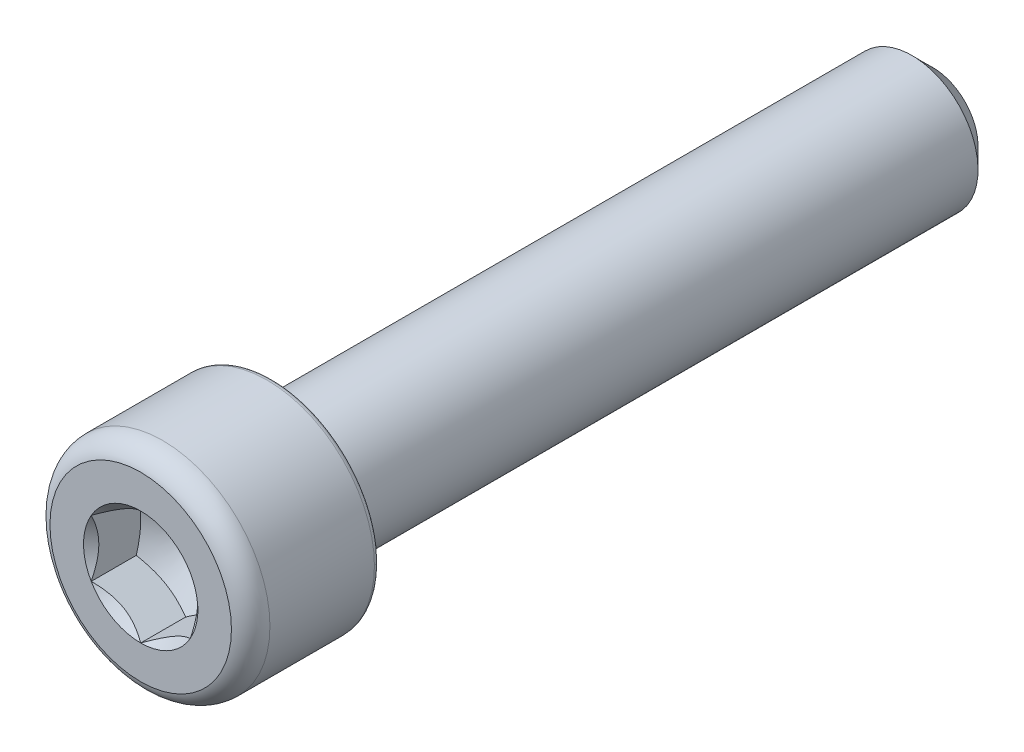
ISO-10303-21;
HEADER;
FILE_DESCRIPTION(('STEP AP214'),'2;1');
FILE_NAME('part.step','',(''),(''),'','','');
FILE_SCHEMA(('AUTOMOTIVE_DESIGN { 1 0 10303 214 1 1 1 1 }'));
ENDSEC;
DATA;
#1=APPLICATION_CONTEXT('core data for automotive mechanical design processes');
#2=APPLICATION_PROTOCOL_DEFINITION('international standard','automotive_design',2000,#1);
#3=PRODUCT_CONTEXT('',#1,'mechanical');
#4=PRODUCT('Part','Part','',(#3));
#5=PRODUCT_RELATED_PRODUCT_CATEGORY('part','',(#4));
#6=PRODUCT_DEFINITION_FORMATION('','',#4);
#7=PRODUCT_DEFINITION_CONTEXT('part definition',#1,'design');
#8=PRODUCT_DEFINITION('design','',#6,#7);
#9=PRODUCT_DEFINITION_SHAPE('','',#8);
#10=(LENGTH_UNIT() NAMED_UNIT(*) SI_UNIT(.MILLI.,.METRE.));
#11=(NAMED_UNIT(*) PLANE_ANGLE_UNIT() SI_UNIT($,.RADIAN.));
#12=(NAMED_UNIT(*) SI_UNIT($,.STERADIAN.) SOLID_ANGLE_UNIT());
#13=UNCERTAINTY_MEASURE_WITH_UNIT(LENGTH_MEASURE(1.E-05),#10,'distance_accuracy_value','');
#14=(GEOMETRIC_REPRESENTATION_CONTEXT(3) GLOBAL_UNCERTAINTY_ASSIGNED_CONTEXT((#13)) GLOBAL_UNIT_ASSIGNED_CONTEXT((#10,
#11,#12)) REPRESENTATION_CONTEXT('',''));
#15=CARTESIAN_POINT('',(0.,0.,0.));
#16=DIRECTION('',(0.,0.,1.));
#17=DIRECTION('',(1.,0.,0.));
#18=AXIS2_PLACEMENT_3D('',#15,#16,#17);
#19=CARTESIAN_POINT('',(2.77555756156289E-13,3.46410161513801,-40.001));
#20=DIRECTION('',(-0.500000000000194,0.866025403784333,0.));
#21=DIRECTION('',(0.,0.,1.));
#22=AXIS2_PLACEMENT_3D('',#19,#20,#21);
#23=PLANE('',#22);
#24=DIRECTION('',(0.,0.,1.));
#25=VECTOR('',#24,1.);
#26=CARTESIAN_POINT('',(2.77555756156289E-13,3.46410161513801,-40.001));
#27=LINE('',#26,#25);
#28=CARTESIAN_POINT('',(3.33066907387547E-13,3.46410161513841,5.26794919243118));
#29=VERTEX_POINT('',#28);
#30=CARTESIAN_POINT('',(2.77555756156289E-13,3.46410161513817,8.00000000000023));
#31=VERTEX_POINT('',#30);
#32=EDGE_CURVE('E90',#29,#31,#27,.T.);
#33=ORIENTED_EDGE('',*,*,#32,.T.);
#34=CARTESIAN_POINT('',(2.77555756156289E-13,3.46410161513801,8.00000000000001));
#35=CARTESIAN_POINT('',(-0.103111458400397,3.40457018687381,7.94052569636649));
#36=CARTESIAN_POINT('',(-0.207946952701811,3.34404338601823,7.88454499923359));
#37=CARTESIAN_POINT('',(-0.421717283964763,3.22062302771875,7.78204673285732));
#38=CARTESIAN_POINT('',(-0.530672439387035,3.15771773940607,7.7355861749818));
#39=CARTESIAN_POINT('',(-0.75037514554537,3.0308723228638,7.65599891920528));
#40=CARTESIAN_POINT('',(-0.861066775102813,2.96696448074175,7.6226722358677));
#41=CARTESIAN_POINT('',(-1.08488631359684,2.83774220994224,7.57132616069147));
#42=CARTESIAN_POINT('',(-1.19800738988464,2.77243172609642,7.55326845522562));
#43=CARTESIAN_POINT('',(-1.39297651977399,2.65986624647108,7.53697523660008));
#44=CARTESIAN_POINT('',(-1.47457294024025,2.61275653114996,7.53456399613885));
#45=CARTESIAN_POINT('',(-1.63763295194036,2.5186137895008,7.53863151800921));
#46=CARTESIAN_POINT('',(-1.71909648659805,2.47158079583702,7.54511339636598));
#47=CARTESIAN_POINT('',(-1.88125166539161,2.37796045971001,7.56659704582311));
#48=CARTESIAN_POINT('',(-1.96194234377534,2.33137367482404,7.58160834257759));
#49=CARTESIAN_POINT('',(-2.12193782914344,2.23900023827762,7.6193315134903));
#50=CARTESIAN_POINT('',(-2.20124274192261,2.19321352553653,7.64204279707655));
#51=CARTESIAN_POINT('',(-2.34201325186341,2.1119396337282,7.6887637141652));
#52=CARTESIAN_POINT('',(-2.403790802559,2.07627234820417,7.71154386353576));
#53=CARTESIAN_POINT('',(-2.52623714694077,2.005577918314,7.76077453968896));
#54=CARTESIAN_POINT('',(-2.58690590713626,1.97055079328373,7.78722517713096));
#55=CARTESIAN_POINT('',(-2.70694350306049,1.90124705496397,7.84320408343037));
#56=CARTESIAN_POINT('',(-2.76631575256041,1.86696847073277,7.8727226728238));
#57=CARTESIAN_POINT('',(-2.88396102179764,1.79904594286974,7.93445005428535));
#58=CARTESIAN_POINT('',(-2.94223468873338,1.76540162557773,7.96665719763615));
#59=CARTESIAN_POINT('',(-2.99999999999973,1.73205080756832,7.9999999999994));
#60=B_SPLINE_CURVE_WITH_KNOTS('',3,(#34,#35,#36,#37,#38,#39,#40,#41,#42,#43,#44,#45,#46,#47,#48,
#49,#50,#51,#52,#53,#54,#55,#56,#57,#58,#59),.UNSPECIFIED.,.F.,.F.,(4,2,2,2,2,2,2,2,2,2,2,2,4),
(0.,0.399548839741992,0.801424624398686,1.19691998044408,1.59141997110831,1.87377108834585,
2.15622116275918,2.43898729915445,2.72173175291632,2.94627735489401,3.17082972803472,
3.39469398397043,3.61842195288795),.UNSPECIFIED.);
#61=CARTESIAN_POINT('',(-3.00000000000017,1.73205080756861,7.99999999999967));
#62=VERTEX_POINT('',#61);
#63=EDGE_CURVE('E101',#31,#62,#60,.T.);
#64=ORIENTED_EDGE('',*,*,#63,.T.);
#65=DIRECTION('',(0.,0.,1.));
#66=VECTOR('',#65,1.);
#67=CARTESIAN_POINT('',(-3.00000000000006,1.73205080756893,-40.001));
#68=LINE('',#67,#66);
#69=CARTESIAN_POINT('',(-3.00000000000006,1.73205080756893,5.2679491924309));
#70=VERTEX_POINT('',#69);
#71=EDGE_CURVE('E11',#70,#62,#68,.T.);
#72=ORIENTED_EDGE('',*,*,#71,.F.);
#73=CARTESIAN_POINT('',(2.77555756156289E-13,3.46410161513801,5.26794919243101));
#74=CARTESIAN_POINT('',(-0.131831831344277,3.38798847182341,5.223992510121));
#75=CARTESIAN_POINT('',(-0.264801633181531,3.31121832093855,5.18401620808137));
#76=CARTESIAN_POINT('',(-0.53304352002885,3.15634879535926,5.11423877353145));
#77=CARTESIAN_POINT('',(-0.668320369626641,3.07824666982881,5.08446232293819));
#78=CARTESIAN_POINT('',(-0.93719765063798,2.92301029925783,5.03811313085015));
#79=CARTESIAN_POINT('',(-1.07075672342428,2.84589993263187,5.02123187382635));
#80=CARTESIAN_POINT('',(-1.33850298069265,2.69131655892348,5.00108294462666));
#81=CARTESIAN_POINT('',(-1.47268919265765,2.61384411332406,4.99779858339232));
#82=CARTESIAN_POINT('',(-1.7234017345643,2.46909515976495,5.00464862766313));
#83=CARTESIAN_POINT('',(-1.83996568596538,2.40179693104556,5.01310112025526));
#84=CARTESIAN_POINT('',(-2.07233421264668,2.26763889961476,5.03988514350801));
#85=CARTESIAN_POINT('',(-2.18813798482608,2.20077956057381,5.05822581458377));
#86=CARTESIAN_POINT('',(-2.42098521258644,2.06634515094625,5.10407394243822));
#87=CARTESIAN_POINT('',(-2.53799921307495,1.9987870862652,5.13177565575813));
#88=CARTESIAN_POINT('',(-2.77028245500699,1.86467829400746,5.19464683368964));
#89=CARTESIAN_POINT('',(-2.88555466997176,1.79812584966748,5.22980153555891));
#90=CARTESIAN_POINT('',(-2.99999999999973,1.73205080756844,5.26794919243062));
#91=B_SPLINE_CURVE_WITH_KNOTS('',3,(#73,#74,#75,#76,#77,#78,#79,#80,#81,#82,#83,#84,#85,#86,#87,
#88,#89,#90),.UNSPECIFIED.,.F.,.F.,(4,2,2,2,2,2,2,2,4),(0.,0.475524017335312,0.952190725540709,
1.41706140922947,1.88136133334686,2.28556167394802,2.69013629069183,3.10368243373325,
3.51641696027272),.UNSPECIFIED.);
#92=EDGE_CURVE('E21',#29,#70,#91,.T.);
#93=ORIENTED_EDGE('',*,*,#92,.F.);
#94=EDGE_LOOP('',(#33,#64,#72,#93));
#95=FACE_BOUND('',#94,.T.);
#96=ADVANCED_FACE('F17',(#95),#23,.F.);
#97=CARTESIAN_POINT('',(-3.00000000000006,1.73205080756893,-40.001));
#98=DIRECTION('',(-1.00000000000001,0.,0.));
#99=DIRECTION('',(0.,0.,1.));
#100=AXIS2_PLACEMENT_3D('',#97,#98,#99);
#101=PLANE('',#100);
#102=ORIENTED_EDGE('',*,*,#71,.T.);
#103=CARTESIAN_POINT('',(-3.,1.73205080756907,7.99999999999984));
#104=CARTESIAN_POINT('',(-3.00000000000007,1.61298795104074,7.94052569636642));
#105=CARTESIAN_POINT('',(-3.00000000000007,1.49193434932966,7.88454499923356));
#106=CARTESIAN_POINT('',(-3.00000000000005,1.24509363273084,7.78204673285737));
#107=CARTESIAN_POINT('',(-3.00000000000003,1.11928305610555,7.73558617498188));
#108=CARTESIAN_POINT('',(-3.00000000000009,0.865592223021153,7.65599891920546));
#109=CARTESIAN_POINT('',(-3.00000000000016,0.73777653877711,7.62267223586795));
#110=CARTESIAN_POINT('',(-2.99999999999995,0.479331997178312,7.57132616069169));
#111=CARTESIAN_POINT('',(-2.99999999999967,0.348711029486792,7.55326845522573));
#112=CARTESIAN_POINT('',(-2.99999999999977,0.12358007023627,7.53697523660029));
#113=CARTESIAN_POINT('',(-2.99999999999998,0.0293606395940688,7.53456399613918));
#114=CARTESIAN_POINT('',(-3.00000000000013,-0.158924843704159,7.53863151800962));
#115=CARTESIAN_POINT('',(-3.00000000000007,-0.252990831031675,7.54511339636637));
#116=CARTESIAN_POINT('',(-3.00000000000005,-0.440231503285571,7.56659704582352));
#117=CARTESIAN_POINT('',(-3.00000000000009,-0.533405073057443,7.58160834257806));
#118=CARTESIAN_POINT('',(-3.00000000000003,-0.718151946150252,7.61933151349066));
#119=CARTESIAN_POINT('',(-2.99999999999994,-0.809725371632482,7.64204279707675));
#120=CARTESIAN_POINT('',(-2.99999999999996,-0.972273155249088,7.68876371416545));
#121=CARTESIAN_POINT('',(-3.00000000000003,-1.04360772629707,7.71154386353616));
#122=CARTESIAN_POINT('',(-3.00000000000009,-1.18499658607738,7.7607745396895));
#123=CARTESIAN_POINT('',(-3.00000000000007,-1.25505083613797,7.78722517713149));
#124=CARTESIAN_POINT('',(-3.00000000000005,-1.39365831277755,7.84320408343094));
#125=CARTESIAN_POINT('',(-3.00000000000005,-1.46221548123995,7.87272267282442));
#126=CARTESIAN_POINT('',(-3.00000000000006,-1.59806053696608,7.93445005428598));
#127=CARTESIAN_POINT('',(-3.00000000000007,-1.66534917155018,7.96665719763675));
#128=CARTESIAN_POINT('',(-3.00000000000006,-1.73205080756918,7.99999999999984));
#129=B_SPLINE_CURVE_WITH_KNOTS('',3,(#103,#104,#105,#106,#107,#108,#109,#110,#111,#112,#113,
#114,#115,#116,#117,#118,#119,#120,#121,#122,#123,#124,#125,#126,#127,#128),.UNSPECIFIED.,.F.,
.F.,(4,2,2,2,2,2,2,2,2,2,2,2,4),(0.,0.399548839741841,0.801424624398447,1.19691998044373,
1.59141997110779,1.87377108834528,2.15622116275856,2.43898729915379,2.72173175291561,
2.94627735489345,3.17082972803433,3.39469398397021,3.61842195288787),.UNSPECIFIED.);
#130=CARTESIAN_POINT('',(-2.99999999999989,-1.73205080756902,7.9999999999999));
#131=VERTEX_POINT('',#130);
#132=EDGE_CURVE('E225',#62,#131,#129,.T.);
#133=ORIENTED_EDGE('',*,*,#132,.T.);
#134=DIRECTION('',(0.,0.,1.));
#135=VECTOR('',#134,1.);
#136=CARTESIAN_POINT('',(-2.99999999999995,-1.73205080756905,-40.001));
#137=LINE('',#136,#135);
#138=CARTESIAN_POINT('',(-2.99999999999995,-1.73205080756905,5.2679491924309));
#139=VERTEX_POINT('',#138);
#140=EDGE_CURVE('E31',#139,#131,#137,.T.);
#141=ORIENTED_EDGE('',*,*,#140,.F.);
#142=CARTESIAN_POINT('',(-3.00000000000006,1.73205080756893,5.2679491924309));
#143=CARTESIAN_POINT('',(-3.00000000000008,1.57982452093985,5.22399251012094));
#144=CARTESIAN_POINT('',(-3.00000000000007,1.42628421917022,5.18401620808133));
#145=CARTESIAN_POINT('',(-3.00000000000005,1.11654516801179,5.11423877353147));
#146=CARTESIAN_POINT('',(-3.00000000000004,0.960340916950987,5.08446232293824));
#147=CARTESIAN_POINT('',(-3.00000000000008,0.649868175809258,5.03811313085027));
#148=CARTESIAN_POINT('',(-3.00000000000012,0.495647442557484,5.02123187382653));
#149=CARTESIAN_POINT('',(-2.99999999999999,0.18648069514075,5.00108294462681));
#150=CARTESIAN_POINT('',(-2.99999999999982,0.0315358039417945,4.99779858339241));
#151=CARTESIAN_POINT('',(-2.99999999999985,-0.257962103176266,5.00464862766326));
#152=CARTESIAN_POINT('',(-3.,-0.39255856061481,5.01310112025548));
#153=CARTESIAN_POINT('',(-3.00000000000011,-0.660874623476216,5.03988514350832));
#154=CARTESIAN_POINT('',(-3.00000000000007,-0.794593301558137,5.05822581458407));
#155=CARTESIAN_POINT('',(-3.00000000000005,-1.06346212081321,5.10407394243853));
#156=CARTESIAN_POINT('',(-3.00000000000007,-1.19857825017524,5.13177565575848));
#157=CARTESIAN_POINT('',(-3.00000000000005,-1.4667958346907,5.19464683369001));
#158=CARTESIAN_POINT('',(-3.00000000000002,-1.59990072337072,5.22980153555926));
#159=CARTESIAN_POINT('',(-2.99999999999989,-1.73205080756898,5.2679491924309));
#160=B_SPLINE_CURVE_WITH_KNOTS('',3,(#142,#143,#144,#145,#146,#147,#148,#149,#150,#151,#152,
#153,#154,#155,#156,#157,#158,#159),.UNSPECIFIED.,.F.,.F.,(4,2,2,2,2,2,2,2,4),(0.,
0.475524017335179,0.952190725540463,1.41706140922911,1.88136133334638,2.28556167394759,
2.69013629069147,3.10368243373296,3.51641696027249),.UNSPECIFIED.);
#161=EDGE_CURVE('E106',#70,#139,#160,.T.);
#162=ORIENTED_EDGE('',*,*,#161,.F.);
#163=EDGE_LOOP('',(#102,#133,#141,#162));
#164=FACE_BOUND('',#163,.T.);
#165=ADVANCED_FACE('F110',(#164),#101,.F.);
#166=CARTESIAN_POINT('',(-2.99999999999995,-1.73205080756905,-40.001));
#167=DIRECTION('',(-0.500000000000195,-0.866025403784334,0.));
#168=DIRECTION('',(-0.866025403784337,0.500000000000193,0.));
#169=AXIS2_PLACEMENT_3D('',#166,#167,#168);
#170=PLANE('',#169);
#171=ORIENTED_EDGE('',*,*,#140,.T.);
#172=CARTESIAN_POINT('',(-2.99999999999995,-1.73205080756905,7.99999999999984));
#173=CARTESIAN_POINT('',(-2.89688854159935,-1.7915822358332,7.94052569636641));
#174=CARTESIAN_POINT('',(-2.79205304729801,-1.85210903668874,7.88454499923359));
#175=CARTESIAN_POINT('',(-2.5782827160352,-1.97552939498814,7.7820467328575));
#176=CARTESIAN_POINT('',(-2.46932756061299,-2.03843468330078,7.73558617498206));
#177=CARTESIAN_POINT('',(-2.2496248544548,-2.16528009984297,7.65599891920573));
#178=CARTESIAN_POINT('',(-2.13893322489744,-2.22918794196498,7.62267223586825));
#179=CARTESIAN_POINT('',(-1.91511368640358,-2.35841021276437,7.5713261606921));
#180=CARTESIAN_POINT('',(-1.80199261011587,-2.42372069661012,7.55326845522623));
#181=CARTESIAN_POINT('',(-1.60702348022663,-2.5362861762354,7.53697523660078));
#182=CARTESIAN_POINT('',(-1.52542705976039,-2.58339589155653,7.53456399613964));
#183=CARTESIAN_POINT('',(-1.36236704806031,-2.67753863320568,7.53863151801007));
#184=CARTESIAN_POINT('',(-1.28090351340262,-2.72457162686945,7.54511339636684));
#185=CARTESIAN_POINT('',(-1.11874833460909,-2.81819196299646,7.56659704582402));
#186=CARTESIAN_POINT('',(-1.03805765622539,-2.86477874788245,7.58160834257855));
#187=CARTESIAN_POINT('',(-0.878062170857256,-2.95715218442881,7.61933151349118));
#188=CARTESIAN_POINT('',(-0.798757258078033,-3.00293889716983,7.64204279707731));
#189=CARTESIAN_POINT('',(-0.657986748137226,-3.08421278897819,7.68876371416601));
#190=CARTESIAN_POINT('',(-0.596209197441661,-3.11988007450229,7.7115438635367));
#191=CARTESIAN_POINT('',(-0.473762853059858,-3.19057450439253,7.76077453969003));
#192=CARTESIAN_POINT('',(-0.413094092864317,-3.22560162942282,7.78722517713202));
#193=CARTESIAN_POINT('',(-0.293056496939993,-3.29490536774261,7.84320408343148));
#194=CARTESIAN_POINT('',(-0.233684247440034,-3.32918395197383,7.87272267282495));
#195=CARTESIAN_POINT('',(-0.11603897820273,-3.39710647983692,7.93445005428653));
#196=CARTESIAN_POINT('',(-0.0577653112669524,-3.430750797129,7.96665719763731));
#197=CARTESIAN_POINT('',(-5.55111512312578E-13,-3.46410161513851,8.00000000000045));
#198=B_SPLINE_CURVE_WITH_KNOTS('',3,(#172,#173,#174,#175,#176,#177,#178,#179,#180,#181,#182,
#183,#184,#185,#186,#187,#188,#189,#190,#191,#192,#193,#194,#195,#196,#197),.UNSPECIFIED.,.F.,
.F.,(4,2,2,2,2,2,2,2,2,2,2,2,4),(0.,0.399548839741647,0.801424624398029,1.19691998044311,
1.59141997110699,1.87377108834449,2.15622116275779,2.43898729915303,2.72173175291486,
2.9462773548927,3.17082972803357,3.39469398396944,3.61842195288709),.UNSPECIFIED.);
#199=CARTESIAN_POINT('',(1.66533453693773E-13,-3.4641016151382,8.00000000000023));
#200=VERTEX_POINT('',#199);
#201=EDGE_CURVE('E221',#131,#200,#198,.T.);
#202=ORIENTED_EDGE('',*,*,#201,.T.);
#203=DIRECTION('',(0.,0.,1.));
#204=VECTOR('',#203,1.);
#205=CARTESIAN_POINT('',(1.11022302462516E-13,-3.46410161513815,-40.001));
#206=LINE('',#205,#204);
#207=CARTESIAN_POINT('',(1.66533453693773E-13,-3.4641016151382,5.26794919243118));
#208=VERTEX_POINT('',#207);
#209=EDGE_CURVE('E232',#208,#200,#206,.T.);
#210=ORIENTED_EDGE('',*,*,#209,.F.);
#211=CARTESIAN_POINT('',(-2.99999999999995,-1.73205080756905,5.2679491924309));
#212=CARTESIAN_POINT('',(-2.86816816865541,-1.80816395088363,5.22399251012095));
#213=CARTESIAN_POINT('',(-2.73519836681818,-1.88493410176848,5.18401620808135));
#214=CARTESIAN_POINT('',(-2.46695647997091,-2.03980362734776,5.11423877353154));
#215=CARTESIAN_POINT('',(-2.33167963037313,-2.11790575287819,5.08446232293833));
#216=CARTESIAN_POINT('',(-2.06280234936183,-2.27314212344914,5.03811313085042));
#217=CARTESIAN_POINT('',(-1.92924327657554,-2.35025249007507,5.02123187382669));
#218=CARTESIAN_POINT('',(-1.66149701930725,-2.50483586378348,5.00108294462704));
#219=CARTESIAN_POINT('',(-1.52731080734233,-2.58230830938295,4.99779858339265));
#220=CARTESIAN_POINT('',(-1.27659826543571,-2.72705726294203,5.00464862766357));
#221=CARTESIAN_POINT('',(-1.1600343140346,-2.79435549166134,5.0131011202558));
#222=CARTESIAN_POINT('',(-0.927665787353302,-2.92851352309209,5.03988514350868));
#223=CARTESIAN_POINT('',(-0.811862015173923,-2.99537286213305,5.05822581458444));
#224=CARTESIAN_POINT('',(-0.579014787413587,-3.1298072717606,5.10407394243892));
#225=CARTESIAN_POINT('',(-0.462000786925081,-3.19736533644163,5.13177565575887));
#226=CARTESIAN_POINT('',(-0.229717544993083,-3.33147412869938,5.19464683369041));
#227=CARTESIAN_POINT('',(-0.114445330028341,-3.3980265730394,5.22980153555968));
#228=CARTESIAN_POINT('',(-4.44089209850063E-13,-3.46410161513855,5.26794919243134));
#229=B_SPLINE_CURVE_WITH_KNOTS('',3,(#211,#212,#213,#214,#215,#216,#217,#218,#219,#220,#221,
#222,#223,#224,#225,#226,#227,#228),.UNSPECIFIED.,.F.,.F.,(4,2,2,2,2,2,2,2,4),(0.,
0.475524017335201,0.952190725540505,1.41706140922917,1.88136133334646,2.28556167394758,
2.69013629069137,3.10368243373277,3.51641696027221),.UNSPECIFIED.);
#230=EDGE_CURVE('E115',#139,#208,#229,.T.);
#231=ORIENTED_EDGE('',*,*,#230,.F.);
#232=EDGE_LOOP('',(#171,#202,#210,#231));
#233=FACE_BOUND('',#232,.T.);
#234=ADVANCED_FACE('F417',(#233),#170,.F.);
#235=CARTESIAN_POINT('',(1.11022302462516E-13,-3.46410161513815,-40.001));
#236=DIRECTION('',(0.500000000000194,-0.866025403784333,0.));
#237=DIRECTION('',(0.,0.,-1.));
#238=AXIS2_PLACEMENT_3D('',#235,#236,#237);
#239=PLANE('',#238);
#240=ORIENTED_EDGE('',*,*,#209,.T.);
#241=CARTESIAN_POINT('',(1.11022302462516E-13,-3.46410161513815,8.00000000000001));
#242=CARTESIAN_POINT('',(0.103111458400811,-3.40457018687397,7.94052569636662));
#243=CARTESIAN_POINT('',(0.207946952702209,-3.34404338601838,7.88454499923375));
#244=CARTESIAN_POINT('',(0.421717283965146,-3.22062302771887,7.78204673285751));
#245=CARTESIAN_POINT('',(0.53067243938742,-3.15771773940618,7.73558617498198));
#246=CARTESIAN_POINT('',(0.750375145545798,-3.03087232286395,7.65599891920553));
#247=CARTESIAN_POINT('',(0.86106677510328,-2.96696448074195,7.62267223586803));
#248=CARTESIAN_POINT('',(1.08488631359718,-2.83774220994231,7.57132616069165));
#249=CARTESIAN_POINT('',(1.19800738988481,-2.77243172609629,7.55326845522556));
#250=CARTESIAN_POINT('',(1.39297651977417,-2.65986624647105,7.53697523660013));
#251=CARTESIAN_POINT('',(1.47457294024052,-2.61275653115009,7.5345639961391));
#252=CARTESIAN_POINT('',(1.63763295194069,-2.51861378950105,7.53863151800959));
#253=CARTESIAN_POINT('',(1.71909648659837,-2.47158079583722,7.5451133963663));
#254=CARTESIAN_POINT('',(1.8812516653919,-2.37796045971019,7.56659704582346));
#255=CARTESIAN_POINT('',(1.96194234377563,-2.33137367482424,7.58160834257803));
#256=CARTESIAN_POINT('',(2.12193782914377,-2.23900023827778,7.61933151349055));
#257=CARTESIAN_POINT('',(2.20124274192296,-2.19321352553661,7.64204279707652));
#258=CARTESIAN_POINT('',(2.34201325186374,-2.1119396337283,7.68876371416523));
#259=CARTESIAN_POINT('',(2.4037908025593,-2.07627234820434,7.71154386353602));
#260=CARTESIAN_POINT('',(2.52623714694106,-2.00557791831422,7.7607745396894));
#261=CARTESIAN_POINT('',(2.58690590713656,-1.97055079328392,7.78722517713133));
#262=CARTESIAN_POINT('',(2.70694350306082,-1.90124705496414,7.84320408343073));
#263=CARTESIAN_POINT('',(2.76631575256075,-1.86696847073294,7.8727226728242));
#264=CARTESIAN_POINT('',(2.88396102179802,-1.79904594286989,7.93445005428571));
#265=CARTESIAN_POINT('',(2.94223468873379,-1.76540162557784,7.96665719763642));
#266=CARTESIAN_POINT('',(3.00000000000022,-1.73205080756833,7.9999999999994));
#267=B_SPLINE_CURVE_WITH_KNOTS('',3,(#241,#242,#243,#244,#245,#246,#247,#248,#249,#250,#251,
#252,#253,#254,#255,#256,#257,#258,#259,#260,#261,#262,#263,#264,#265,#266),.UNSPECIFIED.,.F.,
.F.,(4,2,2,2,2,2,2,2,2,2,2,2,4),(0.,0.399548839741901,0.801424624398629,1.19691998044401,
1.59141997110816,1.87377108834567,2.15622116275901,2.4389872991543,2.72173175291614,
2.94627735489385,3.17082972803461,3.39469398397037,3.61842195288789),.UNSPECIFIED.);
#268=CARTESIAN_POINT('',(3.00000000000034,-1.73205080756869,7.99999999999967));
#269=VERTEX_POINT('',#268);
#270=EDGE_CURVE('E125',#200,#269,#267,.T.);
#271=ORIENTED_EDGE('',*,*,#270,.T.);
#272=DIRECTION('',(0.,0.,1.));
#273=VECTOR('',#272,1.);
#274=CARTESIAN_POINT('',(3.00000000000028,-1.73205080756911,-40.001));
#275=LINE('',#274,#273);
#276=CARTESIAN_POINT('',(3.00000000000028,-1.73205080756911,5.2679491924309));
#277=VERTEX_POINT('',#276);
#278=EDGE_CURVE('E185',#277,#269,#275,.T.);
#279=ORIENTED_EDGE('',*,*,#278,.F.);
#280=CARTESIAN_POINT('',(1.11022302462516E-13,-3.46410161513815,5.26794919243101));
#281=CARTESIAN_POINT('',(0.131831831344675,-3.38798847182357,5.22399251012108));
#282=CARTESIAN_POINT('',(0.264801633181915,-3.31121832093871,5.18401620808147));
#283=CARTESIAN_POINT('',(0.533043520029211,-3.1563487953594,5.11423877353157));
#284=CARTESIAN_POINT('',(0.668320369626993,-3.07824666982895,5.08446232293831));
#285=CARTESIAN_POINT('',(0.937197650638342,-2.92301029925801,5.03811313085031));
#286=CARTESIAN_POINT('',(1.07075672342466,-2.8458999326321,5.02123187382657));
#287=CARTESIAN_POINT('',(1.33850298069294,-2.6913165589236,5.00108294462678));
#288=CARTESIAN_POINT('',(1.47268919265782,-2.61384411332401,4.9977985833923));
#289=CARTESIAN_POINT('',(1.72340173456446,-2.46909515976494,5.00464862766315));
#290=CARTESIAN_POINT('',(1.83996568596563,-2.40179693104571,5.0131011202554));
#291=CARTESIAN_POINT('',(2.07233421264698,-2.26763889961502,5.03988514350825));
#292=CARTESIAN_POINT('',(2.18813798482635,-2.20077956057403,5.05822581458397));
#293=CARTESIAN_POINT('',(2.4209852125867,-2.06634515094646,5.1040739424384));
#294=CARTESIAN_POINT('',(2.53799921307522,-1.99878708626543,5.13177565575834));
#295=CARTESIAN_POINT('',(2.77028245500724,-1.86467829400766,5.19464683368982));
#296=CARTESIAN_POINT('',(2.88555466997199,-1.79812584966763,5.22980153555905));
#297=CARTESIAN_POINT('',(2.99999999999989,-1.73205080756844,5.26794919243062));
#298=B_SPLINE_CURVE_WITH_KNOTS('',3,(#280,#281,#282,#283,#284,#285,#286,#287,#288,#289,#290,
#291,#292,#293,#294,#295,#296,#297),.UNSPECIFIED.,.F.,.F.,(4,2,2,2,2,2,2,2,4),(0.,
0.47552401733526,0.952190725540643,1.41706140922937,1.88136133334672,2.28556167394786,
2.69013629069166,3.10368243373308,3.51641696027253),.UNSPECIFIED.);
#299=EDGE_CURVE('E245',#208,#277,#298,.T.);
#300=ORIENTED_EDGE('',*,*,#299,.F.);
#301=EDGE_LOOP('',(#240,#271,#279,#300));
#302=FACE_BOUND('',#301,.T.);
#303=ADVANCED_FACE('F408',(#302),#239,.F.);
#304=CARTESIAN_POINT('',(3.00000000000028,-1.73205080756911,-40.001));
#305=DIRECTION('',(1.00000000000001,0.,0.));
#306=DIRECTION('',(0.,1.00000000000001,0.));
#307=AXIS2_PLACEMENT_3D('',#304,#305,#306);
#308=PLANE('',#307);
#309=ORIENTED_EDGE('',*,*,#278,.T.);
#310=CARTESIAN_POINT('',(3.00000000000028,-1.73205080756911,7.99999999999984));
#311=CARTESIAN_POINT('',(3.00000000000029,-1.61376575676852,7.9409126490416));
#312=CARTESIAN_POINT('',(3.00000000000029,-1.49351557219546,7.88527542632905));
#313=CARTESIAN_POINT('',(3.00000000000027,-1.24826765075058,7.78329127394735));
#314=CARTESIAN_POINT('',(3.00000000000027,-1.12324441410271,7.7370062086008));
#315=CARTESIAN_POINT('',(3.00000000000029,-0.869584575663879,7.6570818294947));
#316=CARTESIAN_POINT('',(3.00000000000033,-0.740961826580307,7.62339971849526));
#317=CARTESIAN_POINT('',(3.00000000000023,-0.480896618264759,7.57154472451144));
#318=CARTESIAN_POINT('',(3.00000000000011,-0.349464184701177,7.55332388154745));
#319=CARTESIAN_POINT('',(3.00000000000026,-0.181294166955662,7.54115187963579));
#320=CARTESIAN_POINT('',(3.0000000000003,-0.14505355649222,7.5391840307274));
#321=CARTESIAN_POINT('',(3.00000000000026,-0.072543534137533,7.53655715002998));
#322=CARTESIAN_POINT('',(3.00000000000016,-0.036274148616912,7.53589740725304));
#323=CARTESIAN_POINT('',(3.,0.0910409833527144,7.53590083846685));
#324=CARTESIAN_POINT('',(3.00000000000021,0.182111969989198,7.54006524467871));
#325=CARTESIAN_POINT('',(3.00000000000035,0.363556103432977,7.55649323208869));
#326=CARTESIAN_POINT('',(3.00000000000029,0.453928719003215,7.56876246227175));
#327=CARTESIAN_POINT('',(3.00000000000027,0.633747805239797,7.6008240724895));
#328=CARTESIAN_POINT('',(3.00000000000032,0.723188034023971,7.62065109110046));
#329=CARTESIAN_POINT('',(3.00000000000025,0.900347834971257,7.66692147183288));
#330=CARTESIAN_POINT('',(3.00000000000013,0.988066749469463,7.69336731170837));
#331=CARTESIAN_POINT('',(3.00000000000009,1.18810094155961,7.76083336472404));
#332=CARTESIAN_POINT('',(3.00000000000025,1.29974585348472,7.80383797610668));
#333=CARTESIAN_POINT('',(3.0000000000003,1.46423831104501,7.87379605765274));
#334=CARTESIAN_POINT('',(3.00000000000028,1.51833281163837,7.89790156812818));
#335=CARTESIAN_POINT('',(3.00000000000028,1.62575498420668,7.94776323007053));
#336=CARTESIAN_POINT('',(3.00000000000028,1.67908267732413,7.9735193359198));
#337=CARTESIAN_POINT('',(3.00000000000034,1.73205080756909,7.99999999999984));
#338=B_SPLINE_CURVE_WITH_KNOTS('',3,(#310,#311,#312,#313,#314,#315,#316,#317,#318,#319,#320,
#321,#322,#323,#324,#325,#326,#327,#328,#329,#330,#331,#332,#333,#334,#335,#336,#337),
.UNSPECIFIED.,.F.,.F.,(4,2,2,2,2,2,2,2,2,2,2,2,2,4),(0.,0.396939598366384,0.796424671388642,
1.19454058475884,1.59141700304118,1.70028274657173,1.80908930264955,2.08217237250022,
2.35544597975498,2.62998740366371,2.90463175621059,3.2631584208916,3.44080555087934,
3.61844777333362),.UNSPECIFIED.);
#339=CARTESIAN_POINT('',(3.00000000000034,1.73205080756925,7.99999999999995));
#340=VERTEX_POINT('',#339);
#341=EDGE_CURVE('E137',#269,#340,#338,.T.);
#342=ORIENTED_EDGE('',*,*,#341,.T.);
#343=DIRECTION('',(0.,0.,1.));
#344=VECTOR('',#343,1.);
#345=CARTESIAN_POINT('',(3.00000000000045,1.73205080756894,-40.001));
#346=LINE('',#345,#344);
#347=CARTESIAN_POINT('',(3.00000000000045,1.73205080756894,5.2679491924309));
#348=VERTEX_POINT('',#347);
#349=EDGE_CURVE('E50',#348,#340,#346,.T.);
#350=ORIENTED_EDGE('',*,*,#349,.F.);
#351=CARTESIAN_POINT('',(3.00000000000028,-1.73205080756911,5.2679491924309));
#352=CARTESIAN_POINT('',(3.00000000000029,-1.57982452094001,5.22399251012105));
#353=CARTESIAN_POINT('',(3.00000000000028,-1.42628421917035,5.18401620808147));
#354=CARTESIAN_POINT('',(3.00000000000028,-1.1165451680119,5.11423877353163));
#355=CARTESIAN_POINT('',(3.00000000000028,-0.960340916951085,5.08446232293837));
#356=CARTESIAN_POINT('',(3.00000000000029,-0.649868175809331,5.03811313085042));
#357=CARTESIAN_POINT('',(3.0000000000003,-0.495647442557544,5.02123187382669));
#358=CARTESIAN_POINT('',(3.00000000000026,-0.18648069514079,5.00108294462691));
#359=CARTESIAN_POINT('',(3.00000000000022,-0.0315358039418269,4.9977985833924));
#360=CARTESIAN_POINT('',(3.00000000000023,0.257962103176243,5.00464862766327));
#361=CARTESIAN_POINT('',(3.00000000000027,0.39255856061479,5.01310112025557));
#362=CARTESIAN_POINT('',(3.0000000000003,0.660874623476212,5.03988514350848));
#363=CARTESIAN_POINT('',(3.00000000000029,0.794593301558146,5.0582258145842));
#364=CARTESIAN_POINT('',(3.00000000000027,1.06346212081324,5.10407394243866));
#365=CARTESIAN_POINT('',(3.00000000000027,1.19857825017529,5.13177565575862));
#366=CARTESIAN_POINT('',(3.00000000000029,1.46679583469077,5.19464683369013));
#367=CARTESIAN_POINT('',(3.0000000000003,1.5999007233708,5.22980153555935));
#368=CARTESIAN_POINT('',(3.00000000000034,1.73205080756909,5.2679491924309));
#369=B_SPLINE_CURVE_WITH_KNOTS('',3,(#351,#352,#353,#354,#355,#356,#357,#358,#359,#360,#361,
#362,#363,#364,#365,#366,#367,#368),.UNSPECIFIED.,.F.,.F.,(4,2,2,2,2,2,2,2,4),(0.,
0.475524017335193,0.952190725540523,1.4170614092292,1.88136133334649,2.28556167394773,
2.69013629069164,3.10368243373317,3.51641696027272),.UNSPECIFIED.);
#370=EDGE_CURVE('E250',#277,#348,#369,.T.);
#371=ORIENTED_EDGE('',*,*,#370,.F.);
#372=EDGE_LOOP('',(#309,#342,#350,#371));
#373=FACE_BOUND('',#372,.T.);
#374=ADVANCED_FACE('F302',(#373),#308,.F.);
#375=CARTESIAN_POINT('',(3.00000000000045,1.73205080756894,-40.001));
#376=DIRECTION('',(0.500000000000195,0.866025403784334,0.));
#377=DIRECTION('',(0.,0.,-1.));
#378=AXIS2_PLACEMENT_3D('',#375,#376,#377);
#379=PLANE('',#378);
#380=ORIENTED_EDGE('',*,*,#349,.T.);
#381=CARTESIAN_POINT('',(3.00000000000022,1.73205080756898,7.99999999999984));
#382=CARTESIAN_POINT('',(2.89688854159961,1.79158223583321,7.94052569636657));
#383=CARTESIAN_POINT('',(2.79205304729826,1.85210903668877,7.8845449992338));
#384=CARTESIAN_POINT('',(2.57828271603544,1.97552939498818,7.78204673285773));
#385=CARTESIAN_POINT('',(2.46932756061323,2.03843468330081,7.73558617498226));
#386=CARTESIAN_POINT('',(2.24962485445504,2.16528009984302,7.65599891920594));
#387=CARTESIAN_POINT('',(2.13893322489769,2.22918794196506,7.62267223586849));
#388=CARTESIAN_POINT('',(1.91511368640381,2.35841021276438,7.57132616069223));
#389=CARTESIAN_POINT('',(1.80199261011608,2.42372069661004,7.55326845522621));
#390=CARTESIAN_POINT('',(1.60702348022688,2.53628617623534,7.5369752366008));
#391=CARTESIAN_POINT('',(1.52542705976067,2.58339589155652,7.53456399613976));
#392=CARTESIAN_POINT('',(1.36236704806063,2.67753863320571,7.53863151801025));
#393=CARTESIAN_POINT('',(1.28090351340295,2.72457162686946,7.54511339636698));
#394=CARTESIAN_POINT('',(1.11874833460942,2.81819196299643,7.56659704582412));
#395=CARTESIAN_POINT('',(1.03805765622571,2.86477874788238,7.58160834257866));
#396=CARTESIAN_POINT('',(0.87806217085763,2.95715218442883,7.61933151349124));
#397=CARTESIAN_POINT('',(0.798757258078477,3.00293889716998,7.64204279707731));
#398=CARTESIAN_POINT('',(0.657986748137662,3.08421278897831,7.68876371416601));
#399=CARTESIAN_POINT('',(0.596209197442044,3.1198800745023,7.71154386353673));
#400=CARTESIAN_POINT('',(0.473762853060198,3.19057450439246,7.76077453969006));
#401=CARTESIAN_POINT('',(0.413094092864665,3.22560162942278,7.78722517713204));
#402=CARTESIAN_POINT('',(0.293056496940346,3.2949053677426,7.84320408343148));
#403=CARTESIAN_POINT('',(0.233684247440384,3.32918395197382,7.87272267282495));
#404=CARTESIAN_POINT('',(0.116038978203059,3.39710647983689,7.93445005428652));
#405=CARTESIAN_POINT('',(0.0577653112672621,3.43075079712893,7.96665719763731));
#406=CARTESIAN_POINT('',(8.32667268468867E-13,3.46410161513838,8.00000000000045));
#407=B_SPLINE_CURVE_WITH_KNOTS('',3,(#381,#382,#383,#384,#385,#386,#387,#388,#389,#390,#391,
#392,#393,#394,#395,#396,#397,#398,#399,#400,#401,#402,#403,#404,#405,#406),.UNSPECIFIED.,.F.,
.F.,(4,2,2,2,2,2,2,2,2,2,2,2,4),(0.,0.399548839741615,0.801424624398027,1.19691998044311,
1.59141997110697,1.87377108834443,2.1562211627577,2.43898729915293,2.72173175291472,
2.94627735489256,3.17082972803344,3.39469398396932,3.61842195288697),.UNSPECIFIED.);
#408=EDGE_CURVE('E219',#340,#31,#407,.T.);
#409=ORIENTED_EDGE('',*,*,#408,.T.);
#410=ORIENTED_EDGE('',*,*,#32,.F.);
#411=CARTESIAN_POINT('',(3.00000000000022,1.73205080756898,5.2679491924309));
#412=CARTESIAN_POINT('',(2.86816816865571,1.80816395088359,5.22399251012105));
#413=CARTESIAN_POINT('',(2.7351983668185,1.88493410176846,5.18401620808149));
#414=CARTESIAN_POINT('',(2.46695647997126,2.03980362734775,5.11423877353169));
#415=CARTESIAN_POINT('',(2.3316796303735,2.11790575287817,5.08446232293847));
#416=CARTESIAN_POINT('',(2.06280234936221,2.27314212344908,5.03811313085055));
#417=CARTESIAN_POINT('',(1.92924327657593,2.35025249007499,5.02123187382684));
#418=CARTESIAN_POINT('',(1.66149701930769,2.50483586378342,5.00108294462712));
#419=CARTESIAN_POINT('',(1.52731080734281,2.58230830938294,4.99779858339266));
#420=CARTESIAN_POINT('',(1.2765982654362,2.72705726294201,5.00464862766356));
#421=CARTESIAN_POINT('',(1.16003431403505,2.79435549166128,5.01310112025584));
#422=CARTESIAN_POINT('',(0.927665787353704,2.92851352309202,5.03988514350874));
#423=CARTESIAN_POINT('',(0.811862015174314,2.995372862133,5.05822581458448));
#424=CARTESIAN_POINT('',(0.57901478741395,3.12980727176057,5.10407394243894));
#425=CARTESIAN_POINT('',(0.462000786925424,3.19736533644161,5.13177565575889));
#426=CARTESIAN_POINT('',(0.229717544993391,3.33147412869938,5.19464683369042));
#427=CARTESIAN_POINT('',(0.114445330028632,3.39802657303941,5.22980153555969));
#428=CARTESIAN_POINT('',(7.21644966006352E-13,3.46410161513856,5.26794919243134));
#429=B_SPLINE_CURVE_WITH_KNOTS('',3,(#411,#412,#413,#414,#415,#416,#417,#418,#419,#420,#421,
#422,#423,#424,#425,#426,#427,#428),.UNSPECIFIED.,.F.,.F.,(4,2,2,2,2,2,2,2,4),(0.,
0.47552401733514,0.952190725540403,1.41706140922902,1.88136133334626,2.28556167394743,
2.69013629069127,3.10368243373272,3.51641696027221),.UNSPECIFIED.);
#430=EDGE_CURVE('E116',#348,#29,#429,.T.);
#431=ORIENTED_EDGE('',*,*,#430,.F.);
#432=EDGE_LOOP('',(#380,#409,#410,#431));
#433=FACE_BOUND('',#432,.T.);
#434=ADVANCED_FACE('F297',(#433),#379,.F.);
#435=CARTESIAN_POINT('',(0.,0.,8.00000000000001));
#436=DIRECTION('',(0.,0.,1.));
#437=DIRECTION('',(1.00000000000001,0.,0.));
#438=AXIS2_PLACEMENT_3D('',#435,#436,#437);
#439=CONICAL_SURFACE('',#438,3.464101615138,0.785398163397);
#440=CARTESIAN_POINT('',(0.,0.,8.00000000000001));
#441=DIRECTION('',(0.,0.,1.));
#442=DIRECTION('',(1.00000000000001,0.,0.));
#443=AXIS2_PLACEMENT_3D('',#440,#441,#442);
#444=CIRCLE('',#443,3.464101615138);
#445=EDGE_CURVE('E191',#31,#62,#444,.T.);
#446=ORIENTED_EDGE('',*,*,#445,.T.);
#447=ORIENTED_EDGE('',*,*,#63,.F.);
#448=EDGE_LOOP('',(#446,#447));
#449=FACE_BOUND('',#448,.T.);
#450=ADVANCED_FACE('F301',(#449),#439,.F.);
#451=CARTESIAN_POINT('',(0.,0.,8.00000000000001));
#452=DIRECTION('',(0.,0.,1.));
#453=DIRECTION('',(1.00000000000001,0.,0.));
#454=AXIS2_PLACEMENT_3D('',#451,#452,#453);
#455=CONICAL_SURFACE('',#454,3.464101615138,0.785398163397);
#456=CARTESIAN_POINT('',(0.,0.,8.00000000000001));
#457=DIRECTION('',(0.,0.,1.));
#458=DIRECTION('',(1.00000000000001,0.,0.));
#459=AXIS2_PLACEMENT_3D('',#456,#457,#458);
#460=CIRCLE('',#459,3.464101615138);
#461=EDGE_CURVE('E214',#62,#131,#460,.T.);
#462=ORIENTED_EDGE('',*,*,#461,.T.);
#463=ORIENTED_EDGE('',*,*,#132,.F.);
#464=EDGE_LOOP('',(#462,#463));
#465=FACE_BOUND('',#464,.T.);
#466=ADVANCED_FACE('F387',(#465),#455,.F.);
#467=CARTESIAN_POINT('',(0.,0.,8.00000000000001));
#468=DIRECTION('',(0.,0.,1.));
#469=DIRECTION('',(1.00000000000001,0.,0.));
#470=AXIS2_PLACEMENT_3D('',#467,#468,#469);
#471=CONICAL_SURFACE('',#470,3.464101615138,0.785398163397);
#472=CARTESIAN_POINT('',(0.,0.,8.00000000000001));
#473=DIRECTION('',(0.,0.,1.));
#474=DIRECTION('',(1.00000000000001,0.,0.));
#475=AXIS2_PLACEMENT_3D('',#472,#473,#474);
#476=CIRCLE('',#475,3.464101615138);
#477=EDGE_CURVE('E209',#131,#200,#476,.T.);
#478=ORIENTED_EDGE('',*,*,#477,.T.);
#479=ORIENTED_EDGE('',*,*,#201,.F.);
#480=EDGE_LOOP('',(#478,#479));
#481=FACE_BOUND('',#480,.T.);
#482=ADVANCED_FACE('F380',(#481),#471,.F.);
#483=CARTESIAN_POINT('',(0.,0.,8.00000000000001));
#484=DIRECTION('',(0.,0.,1.));
#485=DIRECTION('',(1.00000000000001,0.,0.));
#486=AXIS2_PLACEMENT_3D('',#483,#484,#485);
#487=CONICAL_SURFACE('',#486,3.464101615138,0.785398163397);
#488=CARTESIAN_POINT('',(0.,0.,8.00000000000001));
#489=DIRECTION('',(0.,0.,1.));
#490=DIRECTION('',(1.00000000000001,0.,0.));
#491=AXIS2_PLACEMENT_3D('',#488,#489,#490);
#492=CIRCLE('',#491,3.464101615138);
#493=EDGE_CURVE('E202',#200,#269,#492,.T.);
#494=ORIENTED_EDGE('',*,*,#493,.T.);
#495=ORIENTED_EDGE('',*,*,#270,.F.);
#496=EDGE_LOOP('',(#494,#495));
#497=FACE_BOUND('',#496,.T.);
#498=ADVANCED_FACE('F320',(#497),#487,.F.);
#499=CARTESIAN_POINT('',(0.,0.,8.00000000000001));
#500=DIRECTION('',(0.,0.,1.));
#501=DIRECTION('',(1.00000000000001,0.,0.));
#502=AXIS2_PLACEMENT_3D('',#499,#500,#501);
#503=CONICAL_SURFACE('',#502,3.464101615138,0.785398163397);
#504=CARTESIAN_POINT('',(0.,0.,8.00000000000001));
#505=DIRECTION('',(0.,0.,1.));
#506=DIRECTION('',(1.00000000000001,0.,0.));
#507=AXIS2_PLACEMENT_3D('',#504,#505,#506);
#508=CIRCLE('',#507,3.464101615138);
#509=EDGE_CURVE('E199',#340,#31,#508,.T.);
#510=ORIENTED_EDGE('',*,*,#509,.T.);
#511=ORIENTED_EDGE('',*,*,#408,.F.);
#512=EDGE_LOOP('',(#510,#511));
#513=FACE_BOUND('',#512,.T.);
#514=ADVANCED_FACE('F313',(#513),#503,.F.);
#515=CARTESIAN_POINT('',(3.88578058618805E-13,4.00000000000007,0.));
#516=DIRECTION('',(0.,0.,1.));
#517=DIRECTION('',(0.,-1.00000000000001,0.));
#518=AXIS2_PLACEMENT_3D('',#515,#516,#517);
#519=PLANE('',#518);
#520=CARTESIAN_POINT('',(0.,0.,0.));
#521=DIRECTION('',(0.,0.,1.));
#522=DIRECTION('',(0.,-1.00000000000001,0.));
#523=AXIS2_PLACEMENT_3D('',#520,#521,#522);
#524=CIRCLE('',#523,4.);
#525=CARTESIAN_POINT('',(0.,-4.00000000000002,0.));
#526=VERTEX_POINT('',#525);
#527=EDGE_CURVE('E169',#526,#526,#524,.T.);
#528=ORIENTED_EDGE('',*,*,#527,.T.);
#529=EDGE_LOOP('',(#528));
#530=FACE_BOUND('',#529,.T.);
#531=CARTESIAN_POINT('',(0.,0.,0.));
#532=DIRECTION('',(0.,0.,-1.));
#533=DIRECTION('',(0.,-1.00000000000001,0.));
#534=AXIS2_PLACEMENT_3D('',#531,#532,#533);
#535=CIRCLE('',#534,6.166666666667);
#536=CARTESIAN_POINT('',(0.,-6.16666666666703,0.));
#537=VERTEX_POINT('',#536);
#538=EDGE_CURVE('E130',#537,#537,#535,.T.);
#539=ORIENTED_EDGE('',*,*,#538,.T.);
#540=EDGE_LOOP('',(#539));
#541=FACE_BOUND('',#540,.T.);
#542=ADVANCED_FACE('F316',(#530,#541),#519,.F.);
#543=CARTESIAN_POINT('',(0.,0.,-40.));
#544=DIRECTION('',(0.,0.,1.));
#545=DIRECTION('',(0.,-1.00000000000001,0.));
#546=AXIS2_PLACEMENT_3D('',#543,#544,#545);
#547=PLANE('',#546);
#548=CARTESIAN_POINT('',(0.,0.,-40.));
#549=DIRECTION('',(0.,0.,1.));
#550=DIRECTION('',(0.,-1.00000000000001,0.));
#551=AXIS2_PLACEMENT_3D('',#548,#549,#550);
#552=CIRCLE('',#551,2.75);
#553=CARTESIAN_POINT('',(0.,-2.75000000000001,-40.));
#554=VERTEX_POINT('',#553);
#555=EDGE_CURVE('E175',#554,#554,#552,.T.);
#556=ORIENTED_EDGE('',*,*,#555,.F.);
#557=EDGE_LOOP('',(#556));
#558=FACE_BOUND('',#557,.T.);
#559=ADVANCED_FACE('F349',(#558),#547,.F.);
#560=CARTESIAN_POINT('',(4.44089209850063E-13,5.50000000000005,8.00000000000001));
#561=DIRECTION('',(0.,0.,-1.));
#562=DIRECTION('',(-1.00000000000001,0.,0.));
#563=AXIS2_PLACEMENT_3D('',#560,#561,#562);
#564=PLANE('',#563);
#565=CARTESIAN_POINT('',(0.,0.,8.00000000000001));
#566=DIRECTION('',(0.,0.,1.));
#567=DIRECTION('',(0.,-1.00000000000001,0.));
#568=AXIS2_PLACEMENT_3D('',#565,#566,#567);
#569=CIRCLE('',#568,5.5);
#570=CARTESIAN_POINT('',(0.,-5.50000000000003,8.00000000000001));
#571=VERTEX_POINT('',#570);
#572=EDGE_CURVE('E186',#571,#571,#569,.T.);
#573=ORIENTED_EDGE('',*,*,#572,.T.);
#574=EDGE_LOOP('',(#573));
#575=FACE_BOUND('',#574,.T.);
#576=ORIENTED_EDGE('',*,*,#445,.F.);
#577=ORIENTED_EDGE('',*,*,#509,.F.);
#578=CARTESIAN_POINT('',(0.,0.,8.00000000000001));
#579=DIRECTION('',(0.,0.,1.));
#580=DIRECTION('',(1.00000000000001,0.,0.));
#581=AXIS2_PLACEMENT_3D('',#578,#579,#580);
#582=CIRCLE('',#581,3.464101615138);
#583=EDGE_CURVE('E135',#269,#340,#582,.T.);
#584=ORIENTED_EDGE('',*,*,#583,.F.);
#585=ORIENTED_EDGE('',*,*,#493,.F.);
#586=ORIENTED_EDGE('',*,*,#477,.F.);
#587=ORIENTED_EDGE('',*,*,#461,.F.);
#588=EDGE_LOOP('',(#576,#577,#584,#585,#586,#587));
#589=FACE_BOUND('',#588,.T.);
#590=ADVANCED_FACE('F344',(#575,#589),#564,.F.);
#591=CARTESIAN_POINT('',(0.,0.,6.66666666666699));
#592=DIRECTION('',(0.,0.,1.));
#593=DIRECTION('',(0.,-1.00000000000001,0.));
#594=AXIS2_PLACEMENT_3D('',#591,#592,#593);
#595=TOROIDAL_SURFACE('',#594,5.111111111111,1.388888888889);
#596=ORIENTED_EDGE('',*,*,#572,.F.);
#597=EDGE_LOOP('',(#596));
#598=FACE_BOUND('',#597,.T.);
#599=CARTESIAN_POINT('',(0.,0.,6.66666666666699));
#600=DIRECTION('',(0.,0.,1.));
#601=DIRECTION('',(0.,-1.00000000000001,0.));
#602=AXIS2_PLACEMENT_3D('',#599,#600,#601);
#603=CIRCLE('',#602,6.5);
#604=CARTESIAN_POINT('',(0.,-6.50000000000003,6.66666666666699));
#605=VERTEX_POINT('',#604);
#606=EDGE_CURVE('E152',#605,#605,#603,.T.);
#607=ORIENTED_EDGE('',*,*,#606,.T.);
#608=EDGE_LOOP('',(#607));
#609=FACE_BOUND('',#608,.T.);
#610=ADVANCED_FACE('F336',(#598,#609),#595,.T.);
#611=CARTESIAN_POINT('',(0.,0.,-40.));
#612=DIRECTION('',(0.,0.,1.));
#613=DIRECTION('',(0.,-1.00000000000001,0.));
#614=AXIS2_PLACEMENT_3D('',#611,#612,#613);
#615=CONICAL_SURFACE('',#614,2.75,0.785398163397);
#616=CARTESIAN_POINT('',(0.,0.,-38.75));
#617=DIRECTION('',(0.,0.,1.));
#618=DIRECTION('',(0.,-1.00000000000001,0.));
#619=AXIS2_PLACEMENT_3D('',#616,#617,#618);
#620=CIRCLE('',#619,4.);
#621=CARTESIAN_POINT('',(0.,-4.00000000000002,-38.75));
#622=VERTEX_POINT('',#621);
#623=EDGE_CURVE('E161',#622,#622,#620,.T.);
#624=ORIENTED_EDGE('',*,*,#623,.F.);
#625=EDGE_LOOP('',(#624));
#626=FACE_BOUND('',#625,.T.);
#627=ORIENTED_EDGE('',*,*,#555,.T.);
#628=EDGE_LOOP('',(#627));
#629=FACE_BOUND('',#628,.T.);
#630=ADVANCED_FACE('F330',(#626,#629),#615,.T.);
#631=CARTESIAN_POINT('',(0.,0.,3.26794919243101));
#632=DIRECTION('',(0.,0.,1.));
#633=DIRECTION('',(0.,-1.00000000000001,0.));
#634=AXIS2_PLACEMENT_3D('',#631,#632,#633);
#635=CYLINDRICAL_SURFACE('',#634,4.);
#636=ORIENTED_EDGE('',*,*,#527,.F.);
#637=EDGE_LOOP('',(#636));
#638=FACE_BOUND('',#637,.T.);
#639=ORIENTED_EDGE('',*,*,#623,.T.);
#640=EDGE_LOOP('',(#639));
#641=FACE_BOUND('',#640,.T.);
#642=ADVANCED_FACE('F291',(#638,#641),#635,.T.);
#643=CARTESIAN_POINT('',(0.,0.,3.26794919243101));
#644=DIRECTION('',(0.,0.,1.));
#645=DIRECTION('',(0.,-1.00000000000001,0.));
#646=AXIS2_PLACEMENT_3D('',#643,#644,#645);
#647=CYLINDRICAL_SURFACE('',#646,6.5);
#648=ORIENTED_EDGE('',*,*,#606,.F.);
#649=EDGE_LOOP('',(#648));
#650=FACE_BOUND('',#649,.T.);
#651=CARTESIAN_POINT('',(0.,0.,0.333333333333019));
#652=DIRECTION('',(0.,0.,1.));
#653=DIRECTION('',(0.,-1.00000000000001,0.));
#654=AXIS2_PLACEMENT_3D('',#651,#652,#653);
#655=CIRCLE('',#654,6.5);
#656=CARTESIAN_POINT('',(0.,-6.50000000000003,0.333333333333019));
#657=VERTEX_POINT('',#656);
#658=EDGE_CURVE('E131',#657,#657,#655,.T.);
#659=ORIENTED_EDGE('',*,*,#658,.T.);
#660=EDGE_LOOP('',(#659));
#661=FACE_BOUND('',#660,.T.);
#662=ADVANCED_FACE('F284',(#650,#661),#647,.T.);
#663=CARTESIAN_POINT('',(0.,0.,0.333333333333019));
#664=DIRECTION('',(0.,0.,1.));
#665=DIRECTION('',(0.,-1.00000000000001,0.));
#666=AXIS2_PLACEMENT_3D('',#663,#664,#665);
#667=TOROIDAL_SURFACE('',#666,6.166666666667,0.333333333333);
#668=ORIENTED_EDGE('',*,*,#658,.F.);
#669=EDGE_LOOP('',(#668));
#670=FACE_BOUND('',#669,.T.);
#671=ORIENTED_EDGE('',*,*,#538,.F.);
#672=EDGE_LOOP('',(#671));
#673=FACE_BOUND('',#672,.T.);
#674=ADVANCED_FACE('F273',(#670,#673),#667,.T.);
#675=CARTESIAN_POINT('',(0.,0.,8.00000000000001));
#676=DIRECTION('',(0.,0.,1.));
#677=DIRECTION('',(1.00000000000001,0.,0.));
#678=AXIS2_PLACEMENT_3D('',#675,#676,#677);
#679=CONICAL_SURFACE('',#678,3.464101615138,0.785398163397);
#680=ORIENTED_EDGE('',*,*,#341,.F.);
#681=ORIENTED_EDGE('',*,*,#583,.T.);
#682=EDGE_LOOP('',(#680,#681));
#683=FACE_BOUND('',#682,.T.);
#684=ADVANCED_FACE('F270',(#683),#679,.F.);
#685=CARTESIAN_POINT('',(0.,0.,5.));
#686=DIRECTION('',(0.,0.,1.));
#687=DIRECTION('',(0.,-1.00000000000001,0.));
#688=AXIS2_PLACEMENT_3D('',#685,#686,#687);
#689=CONICAL_SURFACE('',#688,3.,1.047197551197);
#690=ORIENTED_EDGE('',*,*,#230,.T.);
#691=ORIENTED_EDGE('',*,*,#299,.T.);
#692=ORIENTED_EDGE('',*,*,#370,.T.);
#693=ORIENTED_EDGE('',*,*,#430,.T.);
#694=ORIENTED_EDGE('',*,*,#92,.T.);
#695=ORIENTED_EDGE('',*,*,#161,.T.);
#696=EDGE_LOOP('',(#690,#691,#692,#693,#694,#695));
#697=FACE_BOUND('',#696,.T.);
#698=CARTESIAN_POINT('',(0.,0.,3.26794919243101));
#699=VERTEX_POINT('',#698);
#700=VERTEX_LOOP('',#699);
#701=FACE_BOUND('',#700,.T.);
#702=ADVANCED_FACE('F114',(#697,#701),#689,.F.);
#703=CLOSED_SHELL('',(#96,#165,#234,#303,#374,#434,#450,#466,#482,#498,#514,#542,#559,#590,#610,
#630,#642,#662,#674,#684,#702));
#704=MANIFOLD_SOLID_BREP('B1',#703);
#705=ADVANCED_BREP_SHAPE_REPRESENTATION('',(#18,#704),#14);
#706=SHAPE_DEFINITION_REPRESENTATION(#9,#705);
ENDSEC;
END-ISO-10303-21;
